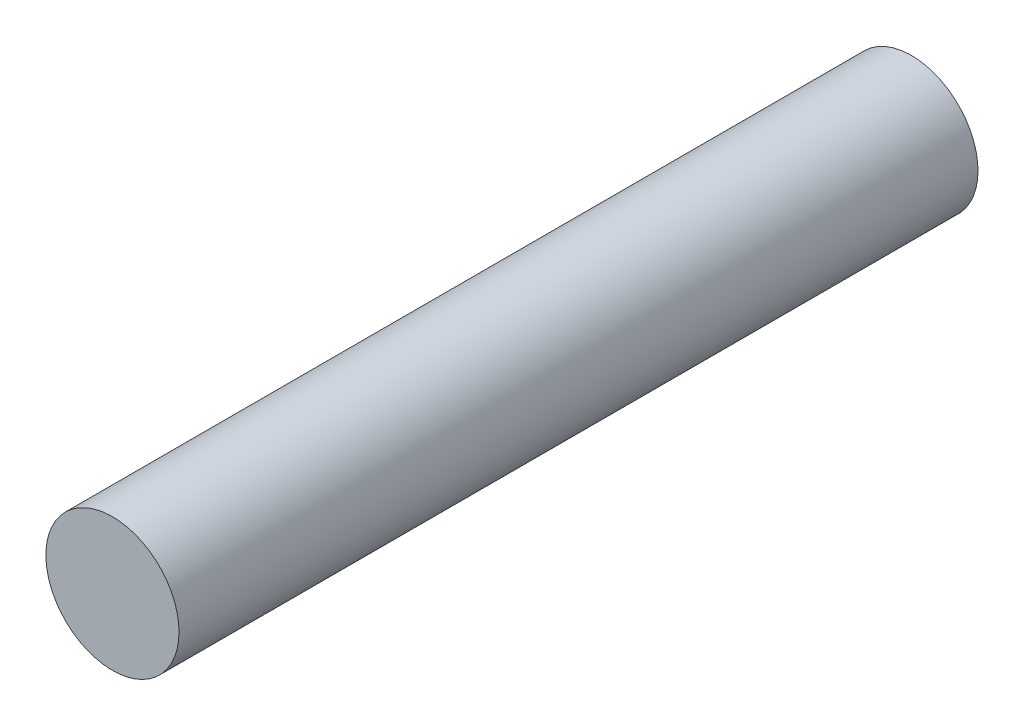
ISO-10303-21;
HEADER;
FILE_DESCRIPTION(('STEP AP214'),'2;1');
FILE_NAME('part.step','',(''),(''),'','','');
FILE_SCHEMA(('AUTOMOTIVE_DESIGN { 1 0 10303 214 1 1 1 1 }'));
ENDSEC;
DATA;
#1=APPLICATION_CONTEXT('core data for automotive mechanical design processes');
#2=APPLICATION_PROTOCOL_DEFINITION('international standard','automotive_design',2000,#1);
#3=PRODUCT_CONTEXT('',#1,'mechanical');
#4=PRODUCT('Part','Part','',(#3));
#5=PRODUCT_RELATED_PRODUCT_CATEGORY('part','',(#4));
#6=PRODUCT_DEFINITION_FORMATION('','',#4);
#7=PRODUCT_DEFINITION_CONTEXT('part definition',#1,'design');
#8=PRODUCT_DEFINITION('design','',#6,#7);
#9=PRODUCT_DEFINITION_SHAPE('','',#8);
#10=(LENGTH_UNIT() NAMED_UNIT(*) SI_UNIT(.MILLI.,.METRE.));
#11=(NAMED_UNIT(*) PLANE_ANGLE_UNIT() SI_UNIT($,.RADIAN.));
#12=(NAMED_UNIT(*) SI_UNIT($,.STERADIAN.) SOLID_ANGLE_UNIT());
#13=UNCERTAINTY_MEASURE_WITH_UNIT(LENGTH_MEASURE(1.E-05),#10,'distance_accuracy_value','');
#14=(GEOMETRIC_REPRESENTATION_CONTEXT(3) GLOBAL_UNCERTAINTY_ASSIGNED_CONTEXT((#13)) GLOBAL_UNIT_ASSIGNED_CONTEXT((#10,
#11,#12)) REPRESENTATION_CONTEXT('',''));
#15=CARTESIAN_POINT('',(0.,0.,0.));
#16=DIRECTION('',(0.,0.,1.));
#17=DIRECTION('',(1.,0.,0.));
#18=AXIS2_PLACEMENT_3D('',#15,#16,#17);
#19=CARTESIAN_POINT('',(0.,0.,24.));
#20=DIRECTION('',(0.,0.,-1.));
#21=DIRECTION('',(-1.,0.,0.));
#22=AXIS2_PLACEMENT_3D('',#19,#20,#21);
#23=CYLINDRICAL_SURFACE('',#22,2.);
#24=CARTESIAN_POINT('',(0.,0.,24.));
#25=DIRECTION('',(0.,0.,1.));
#26=DIRECTION('',(1.,0.,0.));
#27=AXIS2_PLACEMENT_3D('',#24,#25,#26);
#28=CIRCLE('',#27,2.);
#29=CARTESIAN_POINT('',(2.,0.,24.));
#30=VERTEX_POINT('',#29);
#31=EDGE_CURVE('E10',#30,#30,#28,.T.);
#32=ORIENTED_EDGE('',*,*,#31,.F.);
#33=EDGE_LOOP('',(#32));
#34=FACE_BOUND('',#33,.T.);
#35=CARTESIAN_POINT('',(0.,0.,0.));
#36=DIRECTION('',(0.,0.,1.));
#37=DIRECTION('',(1.,0.,0.));
#38=AXIS2_PLACEMENT_3D('',#35,#36,#37);
#39=CIRCLE('',#38,2.);
#40=CARTESIAN_POINT('',(2.,0.,0.));
#41=VERTEX_POINT('',#40);
#42=EDGE_CURVE('E38',#41,#41,#39,.T.);
#43=ORIENTED_EDGE('',*,*,#42,.T.);
#44=EDGE_LOOP('',(#43));
#45=FACE_BOUND('',#44,.T.);
#46=ADVANCED_FACE('F32',(#34,#45),#23,.T.);
#47=CARTESIAN_POINT('',(0.,0.,24.));
#48=DIRECTION('',(0.,0.,1.));
#49=DIRECTION('',(1.,0.,0.));
#50=AXIS2_PLACEMENT_3D('',#47,#48,#49);
#51=PLANE('',#50);
#52=ORIENTED_EDGE('',*,*,#31,.T.);
#53=EDGE_LOOP('',(#52));
#54=FACE_BOUND('',#53,.T.);
#55=ADVANCED_FACE('F47',(#54),#51,.T.);
#56=CARTESIAN_POINT('',(0.,0.,0.));
#57=DIRECTION('',(0.,0.,1.));
#58=DIRECTION('',(1.,0.,0.));
#59=AXIS2_PLACEMENT_3D('',#56,#57,#58);
#60=PLANE('',#59);
#61=ORIENTED_EDGE('',*,*,#42,.F.);
#62=EDGE_LOOP('',(#61));
#63=FACE_BOUND('',#62,.T.);
#64=ADVANCED_FACE('F45',(#63),#60,.F.);
#65=CLOSED_SHELL('',(#46,#55,#64));
#66=MANIFOLD_SOLID_BREP('B2',#65);
#67=ADVANCED_BREP_SHAPE_REPRESENTATION('',(#18,#66),#14);
#68=SHAPE_DEFINITION_REPRESENTATION(#9,#67);
ENDSEC;
END-ISO-10303-21;
